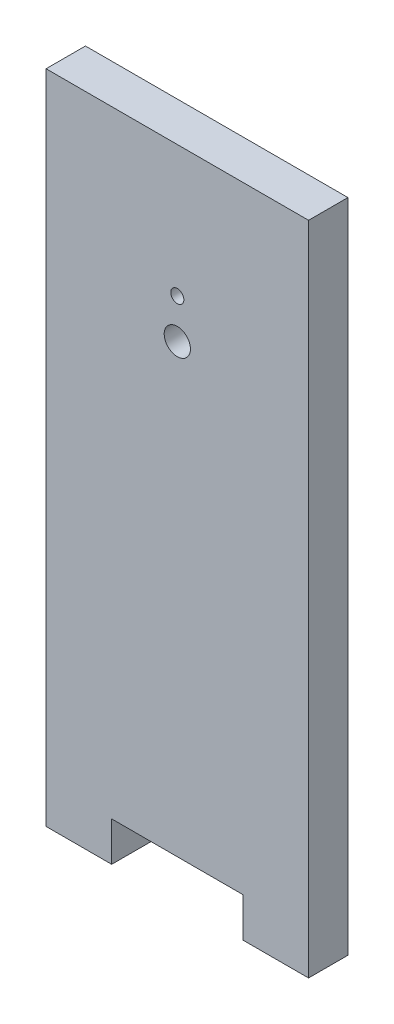
ISO-10303-21;
HEADER;
FILE_DESCRIPTION(('STEP AP214'),'2;1');
FILE_NAME('part.step','',(''),(''),'','','');
FILE_SCHEMA(('AUTOMOTIVE_DESIGN { 1 0 10303 214 1 1 1 1 }'));
ENDSEC;
DATA;
#1=APPLICATION_CONTEXT('core data for automotive mechanical design processes');
#2=APPLICATION_PROTOCOL_DEFINITION('international standard','automotive_design',2000,#1);
#3=PRODUCT_CONTEXT('',#1,'mechanical');
#4=PRODUCT('Part','Part','',(#3));
#5=PRODUCT_RELATED_PRODUCT_CATEGORY('part','',(#4));
#6=PRODUCT_DEFINITION_FORMATION('','',#4);
#7=PRODUCT_DEFINITION_CONTEXT('part definition',#1,'design');
#8=PRODUCT_DEFINITION('design','',#6,#7);
#9=PRODUCT_DEFINITION_SHAPE('','',#8);
#10=(LENGTH_UNIT() NAMED_UNIT(*) SI_UNIT(.MILLI.,.METRE.));
#11=(NAMED_UNIT(*) PLANE_ANGLE_UNIT() SI_UNIT($,.RADIAN.));
#12=(NAMED_UNIT(*) SI_UNIT($,.STERADIAN.) SOLID_ANGLE_UNIT());
#13=UNCERTAINTY_MEASURE_WITH_UNIT(LENGTH_MEASURE(1.E-05),#10,'distance_accuracy_value','');
#14=(GEOMETRIC_REPRESENTATION_CONTEXT(3) GLOBAL_UNCERTAINTY_ASSIGNED_CONTEXT((#13)) GLOBAL_UNIT_ASSIGNED_CONTEXT((#10,
#11,#12)) REPRESENTATION_CONTEXT('',''));
#15=CARTESIAN_POINT('',(0.,0.,0.));
#16=DIRECTION('',(0.,0.,1.));
#17=DIRECTION('',(1.,0.,0.));
#18=AXIS2_PLACEMENT_3D('',#15,#16,#17);
#19=CARTESIAN_POINT('',(0.,0.,3.));
#20=DIRECTION('',(0.,0.,1.));
#21=DIRECTION('',(1.,0.,0.));
#22=AXIS2_PLACEMENT_3D('',#19,#20,#21);
#23=PLANE('',#22);
#24=CARTESIAN_POINT('',(0.,15.,3.));
#25=DIRECTION('',(0.,0.,1.));
#26=DIRECTION('',(1.,0.,0.));
#27=AXIS2_PLACEMENT_3D('',#24,#25,#26);
#28=CIRCLE('',#27,0.5);
#29=CARTESIAN_POINT('',(0.499999999999996,15.,3.));
#30=VERTEX_POINT('',#29);
#31=EDGE_CURVE('E146',#30,#30,#28,.T.);
#32=ORIENTED_EDGE('',*,*,#31,.F.);
#33=EDGE_LOOP('',(#32));
#34=FACE_BOUND('',#33,.T.);
#35=DIRECTION('',(0.,-1.,0.));
#36=VECTOR('',#35,1.);
#37=CARTESIAN_POINT('',(-10.,-25.,3.));
#38=LINE('',#37,#36);
#39=CARTESIAN_POINT('',(-10.,25.,3.));
#40=VERTEX_POINT('',#39);
#41=CARTESIAN_POINT('',(-10.,-25.,3.));
#42=VERTEX_POINT('',#41);
#43=EDGE_CURVE('E164',#40,#42,#38,.T.);
#44=ORIENTED_EDGE('',*,*,#43,.T.);
#45=DIRECTION('',(1.,0.,0.));
#46=VECTOR('',#45,1.);
#47=CARTESIAN_POINT('',(-5.,-25.,3.));
#48=LINE('',#47,#46);
#49=CARTESIAN_POINT('',(-5.,-25.,3.));
#50=VERTEX_POINT('',#49);
#51=EDGE_CURVE('E100',#42,#50,#48,.T.);
#52=ORIENTED_EDGE('',*,*,#51,.T.);
#53=DIRECTION('',(0.,1.,0.));
#54=VECTOR('',#53,1.);
#55=CARTESIAN_POINT('',(-5.,-22.,3.));
#56=LINE('',#55,#54);
#57=CARTESIAN_POINT('',(-5.,-22.,3.));
#58=VERTEX_POINT('',#57);
#59=EDGE_CURVE('E185',#50,#58,#56,.T.);
#60=ORIENTED_EDGE('',*,*,#59,.T.);
#61=DIRECTION('',(1.,0.,0.));
#62=VECTOR('',#61,1.);
#63=CARTESIAN_POINT('',(-5.,-22.,3.));
#64=LINE('',#63,#62);
#65=CARTESIAN_POINT('',(5.,-22.,3.));
#66=VERTEX_POINT('',#65);
#67=EDGE_CURVE('E199',#58,#66,#64,.T.);
#68=ORIENTED_EDGE('',*,*,#67,.T.);
#69=DIRECTION('',(0.,-1.,0.));
#70=VECTOR('',#69,1.);
#71=CARTESIAN_POINT('',(5.,-22.,3.));
#72=LINE('',#71,#70);
#73=CARTESIAN_POINT('',(5.,-25.,3.));
#74=VERTEX_POINT('',#73);
#75=EDGE_CURVE('E119',#66,#74,#72,.T.);
#76=ORIENTED_EDGE('',*,*,#75,.T.);
#77=DIRECTION('',(1.,0.,0.));
#78=VECTOR('',#77,1.);
#79=CARTESIAN_POINT('',(10.,-25.,3.));
#80=LINE('',#79,#78);
#81=CARTESIAN_POINT('',(10.,-25.,3.));
#82=VERTEX_POINT('',#81);
#83=EDGE_CURVE('E113',#74,#82,#80,.T.);
#84=ORIENTED_EDGE('',*,*,#83,.T.);
#85=DIRECTION('',(0.,1.,0.));
#86=VECTOR('',#85,1.);
#87=CARTESIAN_POINT('',(10.,-25.,3.));
#88=LINE('',#87,#86);
#89=CARTESIAN_POINT('',(10.,25.,3.));
#90=VERTEX_POINT('',#89);
#91=EDGE_CURVE('E117',#82,#90,#88,.T.);
#92=ORIENTED_EDGE('',*,*,#91,.T.);
#93=DIRECTION('',(-1.,0.,0.));
#94=VECTOR('',#93,1.);
#95=CARTESIAN_POINT('',(10.,25.,3.));
#96=LINE('',#95,#94);
#97=EDGE_CURVE('E57',#90,#40,#96,.T.);
#98=ORIENTED_EDGE('',*,*,#97,.T.);
#99=EDGE_LOOP('',(#44,#52,#60,#68,#76,#84,#92,#98));
#100=FACE_BOUND('',#99,.T.);
#101=CARTESIAN_POINT('',(0.,12.,3.));
#102=DIRECTION('',(0.,0.,1.));
#103=DIRECTION('',(1.,0.,0.));
#104=AXIS2_PLACEMENT_3D('',#101,#102,#103);
#105=CIRCLE('',#104,1.);
#106=CARTESIAN_POINT('',(0.999999999999996,12.,3.));
#107=VERTEX_POINT('',#106);
#108=EDGE_CURVE('E213',#107,#107,#105,.T.);
#109=ORIENTED_EDGE('',*,*,#108,.F.);
#110=EDGE_LOOP('',(#109));
#111=FACE_BOUND('',#110,.T.);
#112=ADVANCED_FACE('F39',(#34,#100,#111),#23,.T.);
#113=CARTESIAN_POINT('',(0.,0.,0.));
#114=DIRECTION('',(0.,0.,1.));
#115=DIRECTION('',(1.,0.,0.));
#116=AXIS2_PLACEMENT_3D('',#113,#114,#115);
#117=PLANE('',#116);
#118=DIRECTION('',(0.,-1.,0.));
#119=VECTOR('',#118,1.);
#120=CARTESIAN_POINT('',(-10.,-25.,0.));
#121=LINE('',#120,#119);
#122=CARTESIAN_POINT('',(-10.,25.,0.));
#123=VERTEX_POINT('',#122);
#124=CARTESIAN_POINT('',(-10.,-25.,0.));
#125=VERTEX_POINT('',#124);
#126=EDGE_CURVE('E141',#123,#125,#121,.T.);
#127=ORIENTED_EDGE('',*,*,#126,.F.);
#128=DIRECTION('',(-1.,0.,0.));
#129=VECTOR('',#128,1.);
#130=CARTESIAN_POINT('',(10.,25.,0.));
#131=LINE('',#130,#129);
#132=CARTESIAN_POINT('',(10.,25.,0.));
#133=VERTEX_POINT('',#132);
#134=EDGE_CURVE('E92',#133,#123,#131,.T.);
#135=ORIENTED_EDGE('',*,*,#134,.F.);
#136=DIRECTION('',(0.,1.,0.));
#137=VECTOR('',#136,1.);
#138=CARTESIAN_POINT('',(10.,-25.,0.));
#139=LINE('',#138,#137);
#140=CARTESIAN_POINT('',(10.,-25.,0.));
#141=VERTEX_POINT('',#140);
#142=EDGE_CURVE('E86',#141,#133,#139,.T.);
#143=ORIENTED_EDGE('',*,*,#142,.F.);
#144=DIRECTION('',(1.,0.,0.));
#145=VECTOR('',#144,1.);
#146=CARTESIAN_POINT('',(10.,-25.,0.));
#147=LINE('',#146,#145);
#148=CARTESIAN_POINT('',(5.,-25.,0.));
#149=VERTEX_POINT('',#148);
#150=EDGE_CURVE('E128',#149,#141,#147,.T.);
#151=ORIENTED_EDGE('',*,*,#150,.F.);
#152=DIRECTION('',(0.,-1.,0.));
#153=VECTOR('',#152,1.);
#154=CARTESIAN_POINT('',(5.,-22.,0.));
#155=LINE('',#154,#153);
#156=CARTESIAN_POINT('',(5.,-22.,0.));
#157=VERTEX_POINT('',#156);
#158=EDGE_CURVE('E155',#157,#149,#155,.T.);
#159=ORIENTED_EDGE('',*,*,#158,.F.);
#160=DIRECTION('',(1.,0.,0.));
#161=VECTOR('',#160,1.);
#162=CARTESIAN_POINT('',(-5.,-22.,0.));
#163=LINE('',#162,#161);
#164=CARTESIAN_POINT('',(-5.,-22.,0.));
#165=VERTEX_POINT('',#164);
#166=EDGE_CURVE('E152',#165,#157,#163,.T.);
#167=ORIENTED_EDGE('',*,*,#166,.F.);
#168=DIRECTION('',(0.,1.,0.));
#169=VECTOR('',#168,1.);
#170=CARTESIAN_POINT('',(-5.,-22.,0.));
#171=LINE('',#170,#169);
#172=CARTESIAN_POINT('',(-5.,-25.,0.));
#173=VERTEX_POINT('',#172);
#174=EDGE_CURVE('E149',#173,#165,#171,.T.);
#175=ORIENTED_EDGE('',*,*,#174,.F.);
#176=DIRECTION('',(1.,0.,0.));
#177=VECTOR('',#176,1.);
#178=CARTESIAN_POINT('',(-5.,-25.,0.));
#179=LINE('',#178,#177);
#180=EDGE_CURVE('E145',#125,#173,#179,.T.);
#181=ORIENTED_EDGE('',*,*,#180,.F.);
#182=EDGE_LOOP('',(#127,#135,#143,#151,#159,#167,#175,#181));
#183=FACE_BOUND('',#182,.T.);
#184=CARTESIAN_POINT('',(0.,15.,0.));
#185=DIRECTION('',(0.,0.,1.));
#186=DIRECTION('',(1.,0.,0.));
#187=AXIS2_PLACEMENT_3D('',#184,#185,#186);
#188=CIRCLE('',#187,0.5);
#189=CARTESIAN_POINT('',(0.499999999999996,15.,0.));
#190=VERTEX_POINT('',#189);
#191=EDGE_CURVE('E209',#190,#190,#188,.T.);
#192=ORIENTED_EDGE('',*,*,#191,.T.);
#193=EDGE_LOOP('',(#192));
#194=FACE_BOUND('',#193,.T.);
#195=CARTESIAN_POINT('',(0.,12.,0.));
#196=DIRECTION('',(0.,0.,1.));
#197=DIRECTION('',(1.,0.,0.));
#198=AXIS2_PLACEMENT_3D('',#195,#196,#197);
#199=CIRCLE('',#198,1.);
#200=CARTESIAN_POINT('',(0.999999999999996,12.,0.));
#201=VERTEX_POINT('',#200);
#202=EDGE_CURVE('E217',#201,#201,#199,.T.);
#203=ORIENTED_EDGE('',*,*,#202,.T.);
#204=EDGE_LOOP('',(#203));
#205=FACE_BOUND('',#204,.T.);
#206=ADVANCED_FACE('F189',(#183,#194,#205),#117,.F.);
#207=CARTESIAN_POINT('',(-10.,-25.,3.));
#208=DIRECTION('',(1.,0.,0.));
#209=DIRECTION('',(0.,0.,-1.));
#210=AXIS2_PLACEMENT_3D('',#207,#208,#209);
#211=PLANE('',#210);
#212=ORIENTED_EDGE('',*,*,#126,.T.);
#213=DIRECTION('',(0.,0.,-1.));
#214=VECTOR('',#213,1.);
#215=CARTESIAN_POINT('',(-10.,-25.,3.));
#216=LINE('',#215,#214);
#217=EDGE_CURVE('E11',#42,#125,#216,.T.);
#218=ORIENTED_EDGE('',*,*,#217,.F.);
#219=ORIENTED_EDGE('',*,*,#43,.F.);
#220=DIRECTION('',(0.,0.,-1.));
#221=VECTOR('',#220,1.);
#222=CARTESIAN_POINT('',(-10.,25.,3.));
#223=LINE('',#222,#221);
#224=EDGE_CURVE('E137',#40,#123,#223,.T.);
#225=ORIENTED_EDGE('',*,*,#224,.T.);
#226=EDGE_LOOP('',(#212,#218,#219,#225));
#227=FACE_BOUND('',#226,.T.);
#228=ADVANCED_FACE('F41',(#227),#211,.F.);
#229=CARTESIAN_POINT('',(-5.,-25.,3.));
#230=DIRECTION('',(0.,1.,0.));
#231=DIRECTION('',(0.,0.,1.));
#232=AXIS2_PLACEMENT_3D('',#229,#230,#231);
#233=PLANE('',#232);
#234=ORIENTED_EDGE('',*,*,#180,.T.);
#235=DIRECTION('',(0.,0.,-1.));
#236=VECTOR('',#235,1.);
#237=CARTESIAN_POINT('',(-5.,-25.,3.));
#238=LINE('',#237,#236);
#239=EDGE_CURVE('E49',#50,#173,#238,.T.);
#240=ORIENTED_EDGE('',*,*,#239,.F.);
#241=ORIENTED_EDGE('',*,*,#51,.F.);
#242=ORIENTED_EDGE('',*,*,#217,.T.);
#243=EDGE_LOOP('',(#234,#240,#241,#242));
#244=FACE_BOUND('',#243,.T.);
#245=ADVANCED_FACE('F251',(#244),#233,.F.);
#246=CARTESIAN_POINT('',(-5.,-22.,3.));
#247=DIRECTION('',(-1.,0.,0.));
#248=DIRECTION('',(0.,0.,1.));
#249=AXIS2_PLACEMENT_3D('',#246,#247,#248);
#250=PLANE('',#249);
#251=ORIENTED_EDGE('',*,*,#174,.T.);
#252=DIRECTION('',(0.,0.,-1.));
#253=VECTOR('',#252,1.);
#254=CARTESIAN_POINT('',(-5.,-22.,3.));
#255=LINE('',#254,#253);
#256=EDGE_CURVE('E175',#58,#165,#255,.T.);
#257=ORIENTED_EDGE('',*,*,#256,.F.);
#258=ORIENTED_EDGE('',*,*,#59,.F.);
#259=ORIENTED_EDGE('',*,*,#239,.T.);
#260=EDGE_LOOP('',(#251,#257,#258,#259));
#261=FACE_BOUND('',#260,.T.);
#262=ADVANCED_FACE('F183',(#261),#250,.F.);
#263=CARTESIAN_POINT('',(-5.,-22.,3.));
#264=DIRECTION('',(0.,1.,0.));
#265=DIRECTION('',(0.,0.,1.));
#266=AXIS2_PLACEMENT_3D('',#263,#264,#265);
#267=PLANE('',#266);
#268=ORIENTED_EDGE('',*,*,#166,.T.);
#269=DIRECTION('',(0.,0.,-1.));
#270=VECTOR('',#269,1.);
#271=CARTESIAN_POINT('',(5.,-22.,3.));
#272=LINE('',#271,#270);
#273=EDGE_CURVE('E171',#66,#157,#272,.T.);
#274=ORIENTED_EDGE('',*,*,#273,.F.);
#275=ORIENTED_EDGE('',*,*,#67,.F.);
#276=ORIENTED_EDGE('',*,*,#256,.T.);
#277=EDGE_LOOP('',(#268,#274,#275,#276));
#278=FACE_BOUND('',#277,.T.);
#279=ADVANCED_FACE('F194',(#278),#267,.F.);
#280=CARTESIAN_POINT('',(5.,-22.,3.));
#281=DIRECTION('',(1.,0.,0.));
#282=DIRECTION('',(0.,1.,0.));
#283=AXIS2_PLACEMENT_3D('',#280,#281,#282);
#284=PLANE('',#283);
#285=ORIENTED_EDGE('',*,*,#158,.T.);
#286=DIRECTION('',(0.,0.,-1.));
#287=VECTOR('',#286,1.);
#288=CARTESIAN_POINT('',(5.,-25.,3.));
#289=LINE('',#288,#287);
#290=EDGE_CURVE('E130',#74,#149,#289,.T.);
#291=ORIENTED_EDGE('',*,*,#290,.F.);
#292=ORIENTED_EDGE('',*,*,#75,.F.);
#293=ORIENTED_EDGE('',*,*,#273,.T.);
#294=EDGE_LOOP('',(#285,#291,#292,#293));
#295=FACE_BOUND('',#294,.T.);
#296=ADVANCED_FACE('F197',(#295),#284,.F.);
#297=CARTESIAN_POINT('',(10.,-25.,3.));
#298=DIRECTION('',(0.,1.,0.));
#299=DIRECTION('',(0.,0.,1.));
#300=AXIS2_PLACEMENT_3D('',#297,#298,#299);
#301=PLANE('',#300);
#302=ORIENTED_EDGE('',*,*,#150,.T.);
#303=DIRECTION('',(0.,0.,-1.));
#304=VECTOR('',#303,1.);
#305=CARTESIAN_POINT('',(10.,-25.,3.));
#306=LINE('',#305,#304);
#307=EDGE_CURVE('E125',#82,#141,#306,.T.);
#308=ORIENTED_EDGE('',*,*,#307,.F.);
#309=ORIENTED_EDGE('',*,*,#83,.F.);
#310=ORIENTED_EDGE('',*,*,#290,.T.);
#311=EDGE_LOOP('',(#302,#308,#309,#310));
#312=FACE_BOUND('',#311,.T.);
#313=ADVANCED_FACE('F126',(#312),#301,.F.);
#314=CARTESIAN_POINT('',(10.,-25.,3.));
#315=DIRECTION('',(-1.,0.,0.));
#316=DIRECTION('',(0.,0.,1.));
#317=AXIS2_PLACEMENT_3D('',#314,#315,#316);
#318=PLANE('',#317);
#319=ORIENTED_EDGE('',*,*,#142,.T.);
#320=DIRECTION('',(0.,0.,-1.));
#321=VECTOR('',#320,1.);
#322=CARTESIAN_POINT('',(10.,25.,3.));
#323=LINE('',#322,#321);
#324=EDGE_CURVE('E131',#90,#133,#323,.T.);
#325=ORIENTED_EDGE('',*,*,#324,.F.);
#326=ORIENTED_EDGE('',*,*,#91,.F.);
#327=ORIENTED_EDGE('',*,*,#307,.T.);
#328=EDGE_LOOP('',(#319,#325,#326,#327));
#329=FACE_BOUND('',#328,.T.);
#330=ADVANCED_FACE('F133',(#329),#318,.F.);
#331=CARTESIAN_POINT('',(10.,25.,3.));
#332=DIRECTION('',(0.,-1.,0.));
#333=DIRECTION('',(0.,0.,-1.));
#334=AXIS2_PLACEMENT_3D('',#331,#332,#333);
#335=PLANE('',#334);
#336=ORIENTED_EDGE('',*,*,#134,.T.);
#337=ORIENTED_EDGE('',*,*,#224,.F.);
#338=ORIENTED_EDGE('',*,*,#97,.F.);
#339=ORIENTED_EDGE('',*,*,#324,.T.);
#340=EDGE_LOOP('',(#336,#337,#338,#339));
#341=FACE_BOUND('',#340,.T.);
#342=ADVANCED_FACE('F239',(#341),#335,.F.);
#343=CARTESIAN_POINT('',(0.,15.,3.));
#344=DIRECTION('',(0.,0.,-1.));
#345=DIRECTION('',(-1.,0.,0.));
#346=AXIS2_PLACEMENT_3D('',#343,#344,#345);
#347=CYLINDRICAL_SURFACE('',#346,0.5);
#348=ORIENTED_EDGE('',*,*,#31,.T.);
#349=EDGE_LOOP('',(#348));
#350=FACE_BOUND('',#349,.T.);
#351=ORIENTED_EDGE('',*,*,#191,.F.);
#352=EDGE_LOOP('',(#351));
#353=FACE_BOUND('',#352,.T.);
#354=ADVANCED_FACE('F236',(#350,#353),#347,.F.);
#355=CARTESIAN_POINT('',(0.,12.,3.));
#356=DIRECTION('',(0.,0.,-1.));
#357=DIRECTION('',(-1.,0.,0.));
#358=AXIS2_PLACEMENT_3D('',#355,#356,#357);
#359=CYLINDRICAL_SURFACE('',#358,1.);
#360=ORIENTED_EDGE('',*,*,#108,.T.);
#361=EDGE_LOOP('',(#360));
#362=FACE_BOUND('',#361,.T.);
#363=ORIENTED_EDGE('',*,*,#202,.F.);
#364=EDGE_LOOP('',(#363));
#365=FACE_BOUND('',#364,.T.);
#366=ADVANCED_FACE('F225',(#362,#365),#359,.F.);
#367=CLOSED_SHELL('',(#112,#206,#228,#245,#262,#279,#296,#313,#330,#342,#354,#366));
#368=MANIFOLD_SOLID_BREP('B2',#367);
#369=ADVANCED_BREP_SHAPE_REPRESENTATION('',(#18,#368),#14);
#370=SHAPE_DEFINITION_REPRESENTATION(#9,#369);
ENDSEC;
END-ISO-10303-21;
